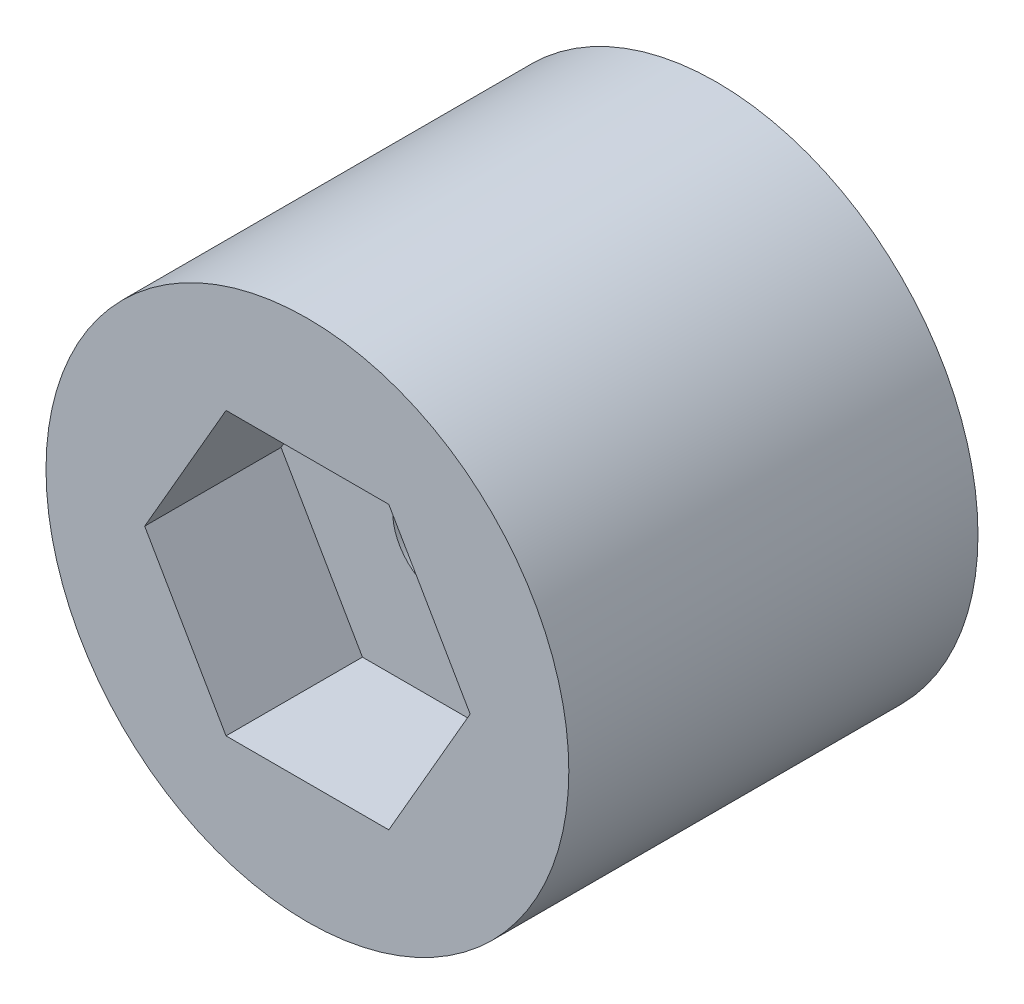
ISO-10303-21;
HEADER;
FILE_DESCRIPTION(('STEP AP214'),'2;1');
FILE_NAME('part.step','',(''),(''),'','','');
FILE_SCHEMA(('AUTOMOTIVE_DESIGN { 1 0 10303 214 1 1 1 1 }'));
ENDSEC;
DATA;
#1=APPLICATION_CONTEXT('core data for automotive mechanical design processes');
#2=APPLICATION_PROTOCOL_DEFINITION('international standard','automotive_design',2000,#1);
#3=PRODUCT_CONTEXT('',#1,'mechanical');
#4=PRODUCT('Part','Part','',(#3));
#5=PRODUCT_RELATED_PRODUCT_CATEGORY('part','',(#4));
#6=PRODUCT_DEFINITION_FORMATION('','',#4);
#7=PRODUCT_DEFINITION_CONTEXT('part definition',#1,'design');
#8=PRODUCT_DEFINITION('design','',#6,#7);
#9=PRODUCT_DEFINITION_SHAPE('','',#8);
#10=(LENGTH_UNIT() NAMED_UNIT(*) SI_UNIT(.MILLI.,.METRE.));
#11=(NAMED_UNIT(*) PLANE_ANGLE_UNIT() SI_UNIT($,.RADIAN.));
#12=(NAMED_UNIT(*) SI_UNIT($,.STERADIAN.) SOLID_ANGLE_UNIT());
#13=UNCERTAINTY_MEASURE_WITH_UNIT(LENGTH_MEASURE(1.E-05),#10,'distance_accuracy_value','');
#14=(GEOMETRIC_REPRESENTATION_CONTEXT(3) GLOBAL_UNCERTAINTY_ASSIGNED_CONTEXT((#13)) GLOBAL_UNIT_ASSIGNED_CONTEXT((#10,
#11,#12)) REPRESENTATION_CONTEXT('',''));
#15=CARTESIAN_POINT('',(0.,0.,0.));
#16=DIRECTION('',(0.,0.,1.));
#17=DIRECTION('',(1.,0.,0.));
#18=AXIS2_PLACEMENT_3D('',#15,#16,#17);
#19=CARTESIAN_POINT('',(0.,0.,-1.));
#20=DIRECTION('',(0.,0.,1.));
#21=DIRECTION('',(1.,0.,0.));
#22=AXIS2_PLACEMENT_3D('',#19,#20,#21);
#23=CYLINDRICAL_SURFACE('',#22,2.25);
#24=CARTESIAN_POINT('',(0.,0.,12.));
#25=DIRECTION('',(0.,0.,1.));
#26=DIRECTION('',(1.,0.,0.));
#27=AXIS2_PLACEMENT_3D('',#24,#25,#26);
#28=CIRCLE('',#27,2.25);
#29=CARTESIAN_POINT('',(2.25,0.,12.));
#30=VERTEX_POINT('',#29);
#31=EDGE_CURVE('E24',#30,#30,#28,.T.);
#32=ORIENTED_EDGE('',*,*,#31,.T.);
#33=EDGE_LOOP('',(#32));
#34=FACE_BOUND('',#33,.T.);
#35=CARTESIAN_POINT('',(0.,0.,8.));
#36=DIRECTION('',(0.,0.,1.));
#37=DIRECTION('',(1.,0.,0.));
#38=AXIS2_PLACEMENT_3D('',#35,#36,#37);
#39=CIRCLE('',#38,2.25);
#40=CARTESIAN_POINT('',(2.25,0.,8.));
#41=VERTEX_POINT('',#40);
#42=EDGE_CURVE('E9',#41,#41,#39,.T.);
#43=ORIENTED_EDGE('',*,*,#42,.F.);
#44=EDGE_LOOP('',(#43));
#45=FACE_BOUND('',#44,.T.);
#46=ADVANCED_FACE('F15',(#34,#45),#23,.F.);
#47=CARTESIAN_POINT('',(0.,0.,8.));
#48=DIRECTION('',(0.,0.,1.));
#49=DIRECTION('',(1.,0.,0.));
#50=AXIS2_PLACEMENT_3D('',#47,#48,#49);
#51=PLANE('',#50);
#52=ORIENTED_EDGE('',*,*,#42,.T.);
#53=EDGE_LOOP('',(#52));
#54=FACE_BOUND('',#53,.T.);
#55=CARTESIAN_POINT('',(0.,0.,8.));
#56=DIRECTION('',(0.,0.,1.));
#57=DIRECTION('',(1.,0.,0.));
#58=AXIS2_PLACEMENT_3D('',#55,#56,#57);
#59=CIRCLE('',#58,4.7);
#60=CARTESIAN_POINT('',(4.7,0.,8.));
#61=VERTEX_POINT('',#60);
#62=EDGE_CURVE('E162',#61,#61,#59,.T.);
#63=ORIENTED_EDGE('',*,*,#62,.F.);
#64=EDGE_LOOP('',(#63));
#65=FACE_BOUND('',#64,.T.);
#66=ADVANCED_FACE('F174',(#54,#65),#51,.F.);
#67=CARTESIAN_POINT('',(0.,0.,12.));
#68=DIRECTION('',(0.,0.,-1.));
#69=DIRECTION('',(0.,-1.,0.));
#70=AXIS2_PLACEMENT_3D('',#67,#68,#69);
#71=PLANE('',#70);
#72=ORIENTED_EDGE('',*,*,#31,.F.);
#73=EDGE_LOOP('',(#72));
#74=FACE_BOUND('',#73,.T.);
#75=DIRECTION('',(0.50000000000019,-0.866025403784329,0.));
#76=VECTOR('',#75,1.);
#77=CARTESIAN_POINT('',(3.579571668976,6.2,12.));
#78=LINE('',#77,#76);
#79=CARTESIAN_POINT('',(3.579571668976,6.2,12.));
#80=VERTEX_POINT('',#79);
#81=CARTESIAN_POINT('',(7.159143337951,0.,12.));
#82=VERTEX_POINT('',#81);
#83=EDGE_CURVE('E79',#80,#82,#78,.T.);
#84=ORIENTED_EDGE('',*,*,#83,.F.);
#85=DIRECTION('',(1.,0.,0.));
#86=VECTOR('',#85,1.);
#87=CARTESIAN_POINT('',(-3.579571668976,6.2,12.));
#88=LINE('',#87,#86);
#89=CARTESIAN_POINT('',(-3.579571668976,6.2,12.));
#90=VERTEX_POINT('',#89);
#91=EDGE_CURVE('E135',#90,#80,#88,.T.);
#92=ORIENTED_EDGE('',*,*,#91,.F.);
#93=DIRECTION('',(0.50000000000019,0.866025403784329,0.));
#94=VECTOR('',#93,1.);
#95=CARTESIAN_POINT('',(-7.159143337951,0.,12.));
#96=LINE('',#95,#94);
#97=CARTESIAN_POINT('',(-7.159143337951,0.,12.));
#98=VERTEX_POINT('',#97);
#99=EDGE_CURVE('E150',#98,#90,#96,.T.);
#100=ORIENTED_EDGE('',*,*,#99,.F.);
#101=DIRECTION('',(-0.50000000000019,0.866025403784329,0.));
#102=VECTOR('',#101,1.);
#103=CARTESIAN_POINT('',(-3.579571668976,-6.2,12.));
#104=LINE('',#103,#102);
#105=CARTESIAN_POINT('',(-3.579571668976,-6.2,12.));
#106=VERTEX_POINT('',#105);
#107=EDGE_CURVE('E157',#106,#98,#104,.T.);
#108=ORIENTED_EDGE('',*,*,#107,.F.);
#109=DIRECTION('',(-1.,0.,0.));
#110=VECTOR('',#109,1.);
#111=CARTESIAN_POINT('',(3.579571668976,-6.2,12.));
#112=LINE('',#111,#110);
#113=CARTESIAN_POINT('',(3.579571668976,-6.2,12.));
#114=VERTEX_POINT('',#113);
#115=EDGE_CURVE('E37',#114,#106,#112,.T.);
#116=ORIENTED_EDGE('',*,*,#115,.F.);
#117=DIRECTION('',(-0.50000000000019,-0.866025403784329,0.));
#118=VECTOR('',#117,1.);
#119=CARTESIAN_POINT('',(7.159143337951,0.,12.));
#120=LINE('',#119,#118);
#121=EDGE_CURVE('E93',#82,#114,#120,.T.);
#122=ORIENTED_EDGE('',*,*,#121,.F.);
#123=EDGE_LOOP('',(#84,#92,#100,#108,#116,#122));
#124=FACE_BOUND('',#123,.T.);
#125=ADVANCED_FACE('F94',(#74,#124),#71,.F.);
#126=CARTESIAN_POINT('',(0.,0.,-0.1));
#127=DIRECTION('',(0.,0.,1.));
#128=DIRECTION('',(1.,0.,0.));
#129=AXIS2_PLACEMENT_3D('',#126,#127,#128);
#130=CYLINDRICAL_SURFACE('',#129,4.7);
#131=ORIENTED_EDGE('',*,*,#62,.T.);
#132=EDGE_LOOP('',(#131));
#133=FACE_BOUND('',#132,.T.);
#134=CARTESIAN_POINT('',(0.,0.,0.));
#135=DIRECTION('',(0.,0.,1.));
#136=DIRECTION('',(1.,0.,0.));
#137=AXIS2_PLACEMENT_3D('',#134,#135,#136);
#138=CIRCLE('',#137,4.7);
#139=CARTESIAN_POINT('',(4.7,0.,0.));
#140=VERTEX_POINT('',#139);
#141=EDGE_CURVE('E109',#140,#140,#138,.T.);
#142=ORIENTED_EDGE('',*,*,#141,.F.);
#143=EDGE_LOOP('',(#142));
#144=FACE_BOUND('',#143,.T.);
#145=ADVANCED_FACE('F173',(#133,#144),#130,.F.);
#146=CARTESIAN_POINT('',(3.579571668976,-6.2,12.));
#147=DIRECTION('',(0.,-1.,0.));
#148=DIRECTION('',(0.,0.,-1.));
#149=AXIS2_PLACEMENT_3D('',#146,#147,#148);
#150=PLANE('',#149);
#151=DIRECTION('',(0.,0.,1.));
#152=VECTOR('',#151,1.);
#153=CARTESIAN_POINT('',(-3.579571668976,-6.2,12.));
#154=LINE('',#153,#152);
#155=CARTESIAN_POINT('',(-3.579571668976,-6.2,18.));
#156=VERTEX_POINT('',#155);
#157=EDGE_CURVE('E154',#106,#156,#154,.T.);
#158=ORIENTED_EDGE('',*,*,#157,.T.);
#159=DIRECTION('',(1.,0.,0.));
#160=VECTOR('',#159,1.);
#161=CARTESIAN_POINT('',(1.789785834488,-6.2,18.));
#162=LINE('',#161,#160);
#163=CARTESIAN_POINT('',(3.579571668976,-6.2,18.));
#164=VERTEX_POINT('',#163);
#165=EDGE_CURVE('E120',#156,#164,#162,.T.);
#166=ORIENTED_EDGE('',*,*,#165,.T.);
#167=DIRECTION('',(0.,0.,1.));
#168=VECTOR('',#167,1.);
#169=CARTESIAN_POINT('',(3.579571668976,-6.2,12.));
#170=LINE('',#169,#168);
#171=EDGE_CURVE('E103',#114,#164,#170,.T.);
#172=ORIENTED_EDGE('',*,*,#171,.F.);
#173=ORIENTED_EDGE('',*,*,#115,.T.);
#174=EDGE_LOOP('',(#158,#166,#172,#173));
#175=FACE_BOUND('',#174,.T.);
#176=ADVANCED_FACE('F181',(#175),#150,.F.);
#177=CARTESIAN_POINT('',(-3.579571668976,-6.2,12.));
#178=DIRECTION('',(-0.866025403784329,-0.50000000000019,0.));
#179=DIRECTION('',(-0.50000000000019,0.866025403784329,0.));
#180=AXIS2_PLACEMENT_3D('',#177,#178,#179);
#181=PLANE('',#180);
#182=DIRECTION('',(0.,0.,1.));
#183=VECTOR('',#182,1.);
#184=CARTESIAN_POINT('',(-7.159143337951,0.,12.));
#185=LINE('',#184,#183);
#186=CARTESIAN_POINT('',(-7.159143337951,0.,18.));
#187=VERTEX_POINT('',#186);
#188=EDGE_CURVE('E147',#98,#187,#185,.T.);
#189=ORIENTED_EDGE('',*,*,#188,.T.);
#190=DIRECTION('',(0.50000000000019,-0.866025403784329,0.));
#191=VECTOR('',#190,1.);
#192=CARTESIAN_POINT('',(-4.47446458622,-4.65,18.));
#193=LINE('',#192,#191);
#194=EDGE_CURVE('E126',#187,#156,#193,.T.);
#195=ORIENTED_EDGE('',*,*,#194,.T.);
#196=ORIENTED_EDGE('',*,*,#157,.F.);
#197=ORIENTED_EDGE('',*,*,#107,.T.);
#198=EDGE_LOOP('',(#189,#195,#196,#197));
#199=FACE_BOUND('',#198,.T.);
#200=ADVANCED_FACE('F223',(#199),#181,.F.);
#201=CARTESIAN_POINT('',(-7.159143337951,0.,12.));
#202=DIRECTION('',(-0.866025403784329,0.50000000000019,0.));
#203=DIRECTION('',(0.,0.,1.));
#204=AXIS2_PLACEMENT_3D('',#201,#202,#203);
#205=PLANE('',#204);
#206=DIRECTION('',(0.,0.,1.));
#207=VECTOR('',#206,1.);
#208=CARTESIAN_POINT('',(-3.579571668976,6.2,12.));
#209=LINE('',#208,#207);
#210=CARTESIAN_POINT('',(-3.579571668976,6.2,18.));
#211=VERTEX_POINT('',#210);
#212=EDGE_CURVE('E90',#90,#211,#209,.T.);
#213=ORIENTED_EDGE('',*,*,#212,.T.);
#214=DIRECTION('',(-0.50000000000019,-0.866025403784329,0.));
#215=VECTOR('',#214,1.);
#216=CARTESIAN_POINT('',(-6.264250420707,1.55,18.));
#217=LINE('',#216,#215);
#218=EDGE_CURVE('E121',#211,#187,#217,.T.);
#219=ORIENTED_EDGE('',*,*,#218,.T.);
#220=ORIENTED_EDGE('',*,*,#188,.F.);
#221=ORIENTED_EDGE('',*,*,#99,.T.);
#222=EDGE_LOOP('',(#213,#219,#220,#221));
#223=FACE_BOUND('',#222,.T.);
#224=ADVANCED_FACE('F231',(#223),#205,.F.);
#225=CARTESIAN_POINT('',(-3.579571668976,6.2,12.));
#226=DIRECTION('',(0.,1.,0.));
#227=DIRECTION('',(1.,0.,0.));
#228=AXIS2_PLACEMENT_3D('',#225,#226,#227);
#229=PLANE('',#228);
#230=DIRECTION('',(0.,0.,1.));
#231=VECTOR('',#230,1.);
#232=CARTESIAN_POINT('',(3.579571668976,6.2,12.));
#233=LINE('',#232,#231);
#234=CARTESIAN_POINT('',(3.579571668976,6.2,18.));
#235=VERTEX_POINT('',#234);
#236=EDGE_CURVE('E86',#80,#235,#233,.T.);
#237=ORIENTED_EDGE('',*,*,#236,.T.);
#238=DIRECTION('',(-1.,0.,0.));
#239=VECTOR('',#238,1.);
#240=CARTESIAN_POINT('',(-1.789785834488,6.2,18.));
#241=LINE('',#240,#239);
#242=EDGE_CURVE('E125',#235,#211,#241,.T.);
#243=ORIENTED_EDGE('',*,*,#242,.T.);
#244=ORIENTED_EDGE('',*,*,#212,.F.);
#245=ORIENTED_EDGE('',*,*,#91,.T.);
#246=EDGE_LOOP('',(#237,#243,#244,#245));
#247=FACE_BOUND('',#246,.T.);
#248=ADVANCED_FACE('F240',(#247),#229,.F.);
#249=CARTESIAN_POINT('',(3.579571668976,6.2,12.));
#250=DIRECTION('',(0.866025403784329,0.50000000000019,0.));
#251=DIRECTION('',(0.,0.,-1.));
#252=AXIS2_PLACEMENT_3D('',#249,#250,#251);
#253=PLANE('',#252);
#254=DIRECTION('',(0.,0.,1.));
#255=VECTOR('',#254,1.);
#256=CARTESIAN_POINT('',(7.159143337951,0.,12.));
#257=LINE('',#256,#255);
#258=CARTESIAN_POINT('',(7.159143337951,0.,18.));
#259=VERTEX_POINT('',#258);
#260=EDGE_CURVE('E84',#82,#259,#257,.T.);
#261=ORIENTED_EDGE('',*,*,#260,.T.);
#262=DIRECTION('',(-0.50000000000019,0.866025403784329,0.));
#263=VECTOR('',#262,1.);
#264=CARTESIAN_POINT('',(4.47446458622,4.65,18.));
#265=LINE('',#264,#263);
#266=EDGE_CURVE('E139',#259,#235,#265,.T.);
#267=ORIENTED_EDGE('',*,*,#266,.T.);
#268=ORIENTED_EDGE('',*,*,#236,.F.);
#269=ORIENTED_EDGE('',*,*,#83,.T.);
#270=EDGE_LOOP('',(#261,#267,#268,#269));
#271=FACE_BOUND('',#270,.T.);
#272=ADVANCED_FACE('F81',(#271),#253,.F.);
#273=CARTESIAN_POINT('',(7.159143337951,0.,12.));
#274=DIRECTION('',(0.866025403784329,-0.50000000000019,0.));
#275=DIRECTION('',(0.,0.,-1.));
#276=AXIS2_PLACEMENT_3D('',#273,#274,#275);
#277=PLANE('',#276);
#278=ORIENTED_EDGE('',*,*,#171,.T.);
#279=DIRECTION('',(0.50000000000019,0.866025403784329,0.));
#280=VECTOR('',#279,1.);
#281=CARTESIAN_POINT('',(6.264250420707,-1.55,18.));
#282=LINE('',#281,#280);
#283=EDGE_CURVE('E101',#164,#259,#282,.T.);
#284=ORIENTED_EDGE('',*,*,#283,.T.);
#285=ORIENTED_EDGE('',*,*,#260,.F.);
#286=ORIENTED_EDGE('',*,*,#121,.T.);
#287=EDGE_LOOP('',(#278,#284,#285,#286));
#288=FACE_BOUND('',#287,.T.);
#289=ADVANCED_FACE('F99',(#288),#277,.F.);
#290=CARTESIAN_POINT('',(0.,0.,0.));
#291=DIRECTION('',(0.,0.,1.));
#292=DIRECTION('',(1.,0.,0.));
#293=AXIS2_PLACEMENT_3D('',#290,#291,#292);
#294=PLANE('',#293);
#295=ORIENTED_EDGE('',*,*,#141,.T.);
#296=EDGE_LOOP('',(#295));
#297=FACE_BOUND('',#296,.T.);
#298=CARTESIAN_POINT('',(0.,0.,0.));
#299=DIRECTION('',(0.,0.,1.));
#300=DIRECTION('',(1.,0.,0.));
#301=AXIS2_PLACEMENT_3D('',#298,#299,#300);
#302=CIRCLE('',#301,11.5);
#303=CARTESIAN_POINT('',(11.5,0.,0.));
#304=VERTEX_POINT('',#303);
#305=EDGE_CURVE('E115',#304,#304,#302,.T.);
#306=ORIENTED_EDGE('',*,*,#305,.F.);
#307=EDGE_LOOP('',(#306));
#308=FACE_BOUND('',#307,.T.);
#309=ADVANCED_FACE('F267',(#297,#308),#294,.F.);
#310=CARTESIAN_POINT('',(0.,0.,18.));
#311=DIRECTION('',(0.,0.,1.));
#312=DIRECTION('',(1.,0.,0.));
#313=AXIS2_PLACEMENT_3D('',#310,#311,#312);
#314=PLANE('',#313);
#315=ORIENTED_EDGE('',*,*,#283,.F.);
#316=ORIENTED_EDGE('',*,*,#165,.F.);
#317=ORIENTED_EDGE('',*,*,#194,.F.);
#318=ORIENTED_EDGE('',*,*,#218,.F.);
#319=ORIENTED_EDGE('',*,*,#242,.F.);
#320=ORIENTED_EDGE('',*,*,#266,.F.);
#321=EDGE_LOOP('',(#315,#316,#317,#318,#319,#320));
#322=FACE_BOUND('',#321,.T.);
#323=CARTESIAN_POINT('',(0.,0.,18.));
#324=DIRECTION('',(0.,0.,1.));
#325=DIRECTION('',(1.,0.,0.));
#326=AXIS2_PLACEMENT_3D('',#323,#324,#325);
#327=CIRCLE('',#326,11.5);
#328=CARTESIAN_POINT('',(11.5,0.,18.));
#329=VERTEX_POINT('',#328);
#330=EDGE_CURVE('E113',#329,#329,#327,.T.);
#331=ORIENTED_EDGE('',*,*,#330,.T.);
#332=EDGE_LOOP('',(#331));
#333=FACE_BOUND('',#332,.T.);
#334=ADVANCED_FACE('F275',(#322,#333),#314,.T.);
#335=CARTESIAN_POINT('',(0.,0.,0.));
#336=DIRECTION('',(0.,0.,1.));
#337=DIRECTION('',(1.,0.,0.));
#338=AXIS2_PLACEMENT_3D('',#335,#336,#337);
#339=CYLINDRICAL_SURFACE('',#338,11.5);
#340=ORIENTED_EDGE('',*,*,#330,.F.);
#341=EDGE_LOOP('',(#340));
#342=FACE_BOUND('',#341,.T.);
#343=ORIENTED_EDGE('',*,*,#305,.T.);
#344=EDGE_LOOP('',(#343));
#345=FACE_BOUND('',#344,.T.);
#346=ADVANCED_FACE('F284',(#342,#345),#339,.T.);
#347=CLOSED_SHELL('',(#46,#66,#125,#145,#176,#200,#224,#248,#272,#289,#309,#334,#346));
#348=MANIFOLD_SOLID_BREP('B1',#347);
#349=ADVANCED_BREP_SHAPE_REPRESENTATION('',(#18,#348),#14);
#350=SHAPE_DEFINITION_REPRESENTATION(#9,#349);
ENDSEC;
END-ISO-10303-21;
